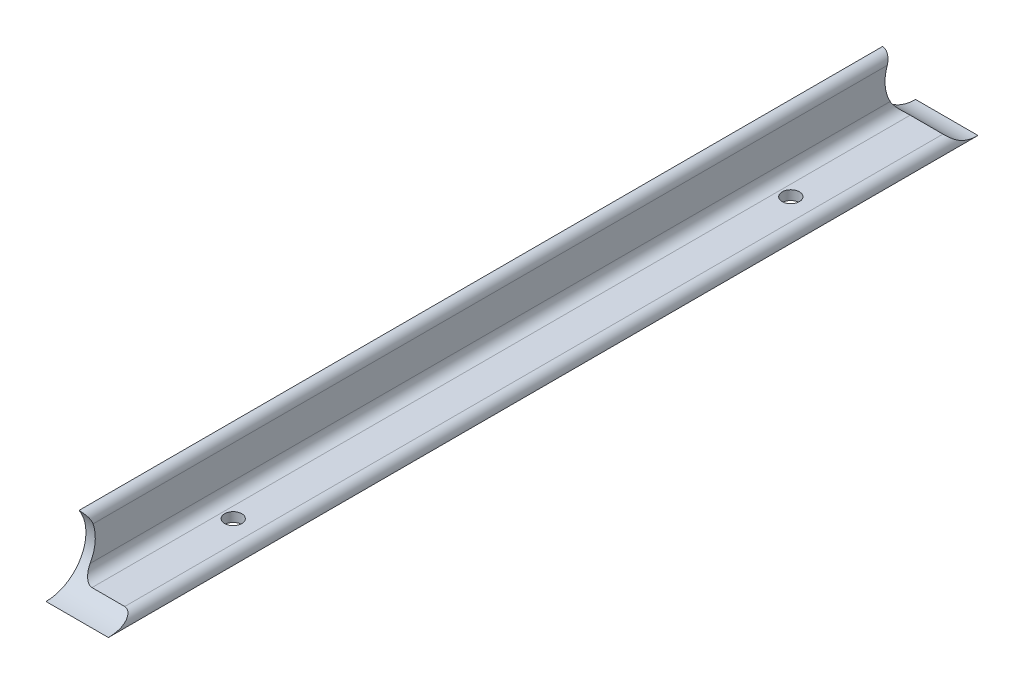
ISO-10303-21;
HEADER;
FILE_DESCRIPTION(('STEP AP214'),'2;1');
FILE_NAME('part.step','',(''),(''),'','','');
FILE_SCHEMA(('AUTOMOTIVE_DESIGN { 1 0 10303 214 1 1 1 1 }'));
ENDSEC;
DATA;
#1=APPLICATION_CONTEXT('core data for automotive mechanical design processes');
#2=APPLICATION_PROTOCOL_DEFINITION('international standard','automotive_design',2000,#1);
#3=PRODUCT_CONTEXT('',#1,'mechanical');
#4=PRODUCT('Part','Part','',(#3));
#5=PRODUCT_RELATED_PRODUCT_CATEGORY('part','',(#4));
#6=PRODUCT_DEFINITION_FORMATION('','',#4);
#7=PRODUCT_DEFINITION_CONTEXT('part definition',#1,'design');
#8=PRODUCT_DEFINITION('design','',#6,#7);
#9=PRODUCT_DEFINITION_SHAPE('','',#8);
#10=(LENGTH_UNIT() NAMED_UNIT(*) SI_UNIT(.MILLI.,.METRE.));
#11=(NAMED_UNIT(*) PLANE_ANGLE_UNIT() SI_UNIT($,.RADIAN.));
#12=(NAMED_UNIT(*) SI_UNIT($,.STERADIAN.) SOLID_ANGLE_UNIT());
#13=UNCERTAINTY_MEASURE_WITH_UNIT(LENGTH_MEASURE(1.E-05),#10,'distance_accuracy_value','');
#14=(GEOMETRIC_REPRESENTATION_CONTEXT(3) GLOBAL_UNCERTAINTY_ASSIGNED_CONTEXT((#13)) GLOBAL_UNIT_ASSIGNED_CONTEXT((#10,
#11,#12)) REPRESENTATION_CONTEXT('',''));
#15=CARTESIAN_POINT('',(0.,0.,0.));
#16=DIRECTION('',(0.,0.,1.));
#17=DIRECTION('',(1.,0.,0.));
#18=AXIS2_PLACEMENT_3D('',#15,#16,#17);
#19=CARTESIAN_POINT('',(17.,0.,181.370967741935));
#20=DIRECTION('',(0.,0.,-1.));
#21=DIRECTION('',(-1.,0.,0.));
#22=AXIS2_PLACEMENT_3D('',#19,#20,#21);
#23=CYLINDRICAL_SURFACE('',#22,3.);
#24=DIRECTION('',(0.,0.,-1.));
#25=VECTOR('',#24,1.);
#26=CARTESIAN_POINT('',(20.,0.,181.370967741935));
#27=LINE('',#26,#25);
#28=CARTESIAN_POINT('',(20.,0.,181.370967741935));
#29=VERTEX_POINT('',#28);
#30=CARTESIAN_POINT('',(20.,0.,-97.3290322580645));
#31=VERTEX_POINT('',#30);
#32=EDGE_CURVE('E13',#29,#31,#27,.T.);
#33=ORIENTED_EDGE('',*,*,#32,.T.);
#34=CARTESIAN_POINT('',(20.,0.,-97.3290322580645));
#35=CARTESIAN_POINT('',(19.9999705919109,-2.30458044158808E-06,-97.151286959261));
#36=CARTESIAN_POINT('',(19.9999989770571,0.00370226592440091,-96.9735418016605));
#37=CARTESIAN_POINT('',(19.9999599122283,0.0185087719111455,-96.6183558390309));
#38=CARTESIAN_POINT('',(19.9998924600866,0.0296108746273782,-96.4409150409735));
#39=CARTESIAN_POINT('',(19.9994499094464,0.0592209383889571,-96.0863520096989));
#40=CARTESIAN_POINT('',(19.9990742937025,0.0777413240784745,-95.9092308142354));
#41=CARTESIAN_POINT('',(19.9975949282692,0.122154254291076,-95.5559203973523));
#42=CARTESIAN_POINT('',(19.9964911898514,0.148046684689876,-95.3797311615484));
#43=CARTESIAN_POINT('',(19.9929752074295,0.207329591468886,-95.0275717615462));
#44=CARTESIAN_POINT('',(19.990555359875,0.240762970703646,-94.8516088849247));
#45=CARTESIAN_POINT('',(19.9836522455287,0.314973916303352,-94.5012803157926));
#46=CARTESIAN_POINT('',(19.9791690254037,0.355751316557974,-94.3269145872507));
#47=CARTESIAN_POINT('',(19.9672227090241,0.444514483171908,-93.9803087533219));
#48=CARTESIAN_POINT('',(19.9597625459986,0.492493125087825,-93.8080667271268));
#49=CARTESIAN_POINT('',(19.9407600650472,0.595547736239831,-93.4659704876463));
#50=CARTESIAN_POINT('',(19.9292185156824,0.650622367998201,-93.2961158310551));
#51=CARTESIAN_POINT('',(19.9024685493769,0.760575693164325,-92.9796859827366));
#52=CARTESIAN_POINT('',(19.887874684371,0.814667920668093,-92.832786020236));
#53=CARTESIAN_POINT('',(19.853481433853,0.927982337980099,-92.5415904722693));
#54=CARTESIAN_POINT('',(19.8336823059246,0.987204273846348,-92.3972947583088));
#55=CARTESIAN_POINT('',(19.7876954025515,1.11044027648882,-92.1119132540419));
#56=CARTESIAN_POINT('',(19.7615123704582,1.1744507609248,-91.9708251651159));
#57=CARTESIAN_POINT('',(19.7013693405175,1.30686409439148,-91.6924043279188));
#58=CARTESIAN_POINT('',(19.6674102916596,1.37526640670857,-91.555071123687));
#59=CARTESIAN_POINT('',(19.5957588590613,1.50556478484685,-91.3046943967056));
#60=CARTESIAN_POINT('',(19.5593322138692,1.56695585378169,-91.1910282741706));
#61=CARTESIAN_POINT('',(19.4785163705227,1.69189081979227,-90.9677215390118));
#62=CARTESIAN_POINT('',(19.4341258880658,1.75543506276086,-90.8580815791151));
#63=CARTESIAN_POINT('',(19.3362692288105,1.88370363459146,-90.6439740071685));
#64=CARTESIAN_POINT('',(19.2828231460854,1.94842507345105,-90.5394955907872));
#65=CARTESIAN_POINT('',(19.1655479709184,2.07798702817957,-90.3366857015394));
#66=CARTESIAN_POINT('',(19.1017259522081,2.14282743337522,-90.2383501036259));
#67=CARTESIAN_POINT('',(18.949823164493,2.28269447552456,-90.0321542582032));
#68=CARTESIAN_POINT('',(18.8594433824431,2.35745098877727,-89.9257711849516));
#69=CARTESIAN_POINT('',(18.6607215587142,2.50140061225797,-89.7268022318402));
#70=CARTESIAN_POINT('',(18.5523984627189,2.57059947737115,-89.6342019929326));
#71=CARTESIAN_POINT('',(18.3377433168696,2.68750138374114,-89.4814219945368));
#72=CARTESIAN_POINT('',(18.2343482603598,2.73684935436311,-89.4184046164781));
#73=CARTESIAN_POINT('',(18.0157301558414,2.82526779578833,-89.3072008653277));
#74=CARTESIAN_POINT('',(17.9005149294213,2.8643450027021,-89.2590047681106));
#75=CARTESIAN_POINT('',(17.6772358802356,2.9245227102832,-89.1855134983669));
#76=CARTESIAN_POINT('',(17.5703779091804,2.94735939747825,-89.1579763954258));
#77=CARTESIAN_POINT('',(17.3522544969219,2.9812787035469,-89.1172458479232));
#78=CARTESIAN_POINT('',(17.2409999263106,2.99238863543523,-89.1040190710948));
#79=CARTESIAN_POINT('',(17.1077454898133,2.99814309911651,-89.0971674443057));
#80=CARTESIAN_POINT('',(17.0862001547962,2.99883941073956,-89.0963383195839));
#81=CARTESIAN_POINT('',(17.0431054203398,2.99976710034989,-89.0952337560037));
#82=CARTESIAN_POINT('',(17.0215560434937,2.99999891199695,-89.0949578007032));
#83=CARTESIAN_POINT('',(17.,3.,-89.0949567179689));
#84=B_SPLINE_CURVE_WITH_KNOTS('',3,(#34,#35,#36,#37,#38,#39,#40,#41,#42,#43,#44,#45,#46,#47,#48,
#49,#50,#51,#52,#53,#54,#55,#56,#57,#58,#59,#60,#61,#62,#63,#64,#65,#66,#67,#68,#69,#70,#71,#72,
#73,#74,#75,#76,#77,#78,#79,#80,#81,#82,#83),.UNSPECIFIED.,.F.,.F.,(4,2,2,2,2,2,2,2,2,2,2,2,2,2,
2,2,2,2,2,2,2,2,2,2,4),(0.,0.533197095279369,1.06640624483335,1.60051220873631,2.13460990476388,
2.67182653411166,3.20903101398115,3.74570747957589,4.28228293803238,4.75377659608735,
5.22524692656226,5.69636800828246,6.16743162473257,6.56983043551344,6.97229419829307,
7.37387633093475,7.77518582667766,8.24881684700328,8.72195092873457,9.11270874235854,
9.5032096331857,9.83984379905429,10.1756921618371,10.2404043939398,10.3050561821395),.UNSPECIFIED.);
#85=CARTESIAN_POINT('',(17.,3.,-89.094956717969));
#86=VERTEX_POINT('',#85);
#87=EDGE_CURVE('E122',#31,#86,#84,.T.);
#88=ORIENTED_EDGE('',*,*,#87,.T.);
#89=DIRECTION('',(0.,0.,-1.));
#90=VECTOR('',#89,1.);
#91=CARTESIAN_POINT('',(17.,3.,181.370967741935));
#92=LINE('',#91,#90);
#93=CARTESIAN_POINT('',(17.,3.,173.13689220184));
#94=VERTEX_POINT('',#93);
#95=EDGE_CURVE('E71',#94,#86,#92,.T.);
#96=ORIENTED_EDGE('',*,*,#95,.F.);
#97=CARTESIAN_POINT('',(20.,0.,181.370967741935));
#98=CARTESIAN_POINT('',(19.9999705919109,-2.30458044134409E-06,181.193222443132));
#99=CARTESIAN_POINT('',(19.9999989770571,0.00370226592439925,181.015477285531));
#100=CARTESIAN_POINT('',(19.9999599122282,0.0185087719111425,180.660291322902));
#101=CARTESIAN_POINT('',(19.9998924600866,0.0296108746273763,180.482850524844));
#102=CARTESIAN_POINT('',(19.9994499094464,0.0592209383889577,180.12828749357));
#103=CARTESIAN_POINT('',(19.9990742937025,0.0777413240784772,179.951166298106));
#104=CARTESIAN_POINT('',(19.9975949282692,0.122154254291079,179.597855881223));
#105=CARTESIAN_POINT('',(19.9964911898514,0.148046684689875,179.421666645419));
#106=CARTESIAN_POINT('',(19.9929752074295,0.207329591468883,179.069507245417));
#107=CARTESIAN_POINT('',(19.990555359875,0.240762970703644,178.893544368796));
#108=CARTESIAN_POINT('',(19.9836522455287,0.314973916303348,178.543215799664));
#109=CARTESIAN_POINT('',(19.9791690254037,0.355751316557967,178.368850071122));
#110=CARTESIAN_POINT('',(19.967222709024,0.444514483171902,178.022244237193));
#111=CARTESIAN_POINT('',(19.9597625459986,0.492493125087822,177.850002210998));
#112=CARTESIAN_POINT('',(19.9407600650472,0.595547736239829,177.507905971517));
#113=CARTESIAN_POINT('',(19.9292185156824,0.650622367998197,177.338051314926));
#114=CARTESIAN_POINT('',(19.9024685493768,0.760575693164322,177.021621466608));
#115=CARTESIAN_POINT('',(19.887874684371,0.814667920668092,176.874721504107));
#116=CARTESIAN_POINT('',(19.853481433853,0.927982337980097,176.58352595614));
#117=CARTESIAN_POINT('',(19.8336823059246,0.987204273846343,176.43923024218));
#118=CARTESIAN_POINT('',(19.7876954025515,1.11044027648881,176.153848737913));
#119=CARTESIAN_POINT('',(19.7615123704582,1.17445076092479,176.012760648987));
#120=CARTESIAN_POINT('',(19.7013693405175,1.30686409439147,175.73433981179));
#121=CARTESIAN_POINT('',(19.6674102916596,1.37526640670856,175.597006607558));
#122=CARTESIAN_POINT('',(19.5957588590613,1.50556478484684,175.346629880577));
#123=CARTESIAN_POINT('',(19.5593322138692,1.56695585378168,175.232963758042));
#124=CARTESIAN_POINT('',(19.4785163705227,1.69189081979227,175.009657022883));
#125=CARTESIAN_POINT('',(19.4341258880658,1.75543506276085,174.900017062986));
#126=CARTESIAN_POINT('',(19.3362692288105,1.88370363459145,174.685909491039));
#127=CARTESIAN_POINT('',(19.2828231460854,1.94842507345105,174.581431074658));
#128=CARTESIAN_POINT('',(19.1655479709184,2.07798702817957,174.37862118541));
#129=CARTESIAN_POINT('',(19.101725952208,2.14282743337523,174.280285587497));
#130=CARTESIAN_POINT('',(18.949823164493,2.28269447552457,174.074089742074));
#131=CARTESIAN_POINT('',(18.859443382443,2.35745098877729,173.967706668823));
#132=CARTESIAN_POINT('',(18.6607215587142,2.50140061225798,173.768737715711));
#133=CARTESIAN_POINT('',(18.5523984627189,2.57059947737116,173.676137476804));
#134=CARTESIAN_POINT('',(18.3377433168696,2.68750138374115,173.523357478408));
#135=CARTESIAN_POINT('',(18.2343482603598,2.73684935436312,173.460340100349));
#136=CARTESIAN_POINT('',(18.0157301558414,2.82526779578833,173.349136349199));
#137=CARTESIAN_POINT('',(17.9005149294213,2.86434500270211,173.300940251982));
#138=CARTESIAN_POINT('',(17.6772358802356,2.9245227102832,173.227448982238));
#139=CARTESIAN_POINT('',(17.5703779091804,2.94735939747825,173.199911879297));
#140=CARTESIAN_POINT('',(17.3522544969218,2.98127870354691,173.159181331794));
#141=CARTESIAN_POINT('',(17.2409999263106,2.99238863543523,173.145954554966));
#142=CARTESIAN_POINT('',(17.1077454898132,2.99814309911651,173.139102928177));
#143=CARTESIAN_POINT('',(17.0862001547962,2.99883941073956,173.138273803455));
#144=CARTESIAN_POINT('',(17.0431054203398,2.99976710034989,173.137169239875));
#145=CARTESIAN_POINT('',(17.0215560434937,2.99999891199695,173.136893284574));
#146=CARTESIAN_POINT('',(17.,3.,173.13689220184));
#147=B_SPLINE_CURVE_WITH_KNOTS('',3,(#97,#98,#99,#100,#101,#102,#103,#104,#105,#106,#107,#108,
#109,#110,#111,#112,#113,#114,#115,#116,#117,#118,#119,#120,#121,#122,#123,#124,#125,#126,#127,
#128,#129,#130,#131,#132,#133,#134,#135,#136,#137,#138,#139,#140,#141,#142,#143,#144,#145,#146),
.UNSPECIFIED.,.F.,.F.,(4,2,2,2,2,2,2,2,2,2,2,2,2,2,2,2,2,2,2,2,2,2,2,2,4),(0.,0.533197095279341,
1.06640624483334,1.60051220873634,2.13460990476388,2.67182653411164,3.20903101398112,
3.74570747957588,4.28228293803239,4.75377659608734,5.22524692656226,5.69636800828244,
6.16743162473256,6.56983043551342,6.97229419829307,7.37387633093476,7.77518582667768,
8.2488168470033,8.72195092873459,9.11270874235857,9.50320963318574,9.83984379905433,
10.1756921618371,10.2404043939398,10.3050561821395),.UNSPECIFIED.);
#148=EDGE_CURVE('E127',#29,#94,#147,.T.);
#149=ORIENTED_EDGE('',*,*,#148,.F.);
#150=EDGE_LOOP('',(#33,#88,#96,#149));
#151=FACE_BOUND('',#150,.T.);
#152=ADVANCED_FACE('F62',(#151),#23,.T.);
#153=CARTESIAN_POINT('',(6.5,3.,181.370967741935));
#154=DIRECTION('',(0.,-1.,0.));
#155=DIRECTION('',(0.,0.,-1.));
#156=AXIS2_PLACEMENT_3D('',#153,#154,#155);
#157=PLANE('',#156);
#158=CARTESIAN_POINT('',(10.,3.,131.370967741935));
#159=DIRECTION('',(0.,-1.,0.));
#160=DIRECTION('',(0.,0.,-1.));
#161=AXIS2_PLACEMENT_3D('',#158,#159,#160);
#162=CIRCLE('',#161,2.75);
#163=CARTESIAN_POINT('',(10.,3.,128.620967741935));
#164=VERTEX_POINT('',#163);
#165=EDGE_CURVE('E252',#164,#164,#162,.T.);
#166=ORIENTED_EDGE('',*,*,#165,.T.);
#167=EDGE_LOOP('',(#166));
#168=FACE_BOUND('',#167,.T.);
#169=CARTESIAN_POINT('',(10.,3.,-47.3290322580645));
#170=DIRECTION('',(0.,-1.,0.));
#171=DIRECTION('',(0.,0.,-1.));
#172=AXIS2_PLACEMENT_3D('',#169,#170,#171);
#173=CIRCLE('',#172,2.75);
#174=CARTESIAN_POINT('',(10.,3.,-50.0790322580645));
#175=VERTEX_POINT('',#174);
#176=EDGE_CURVE('E137',#175,#175,#173,.T.);
#177=ORIENTED_EDGE('',*,*,#176,.T.);
#178=EDGE_LOOP('',(#177));
#179=FACE_BOUND('',#178,.T.);
#180=ORIENTED_EDGE('',*,*,#95,.T.);
#181=DIRECTION('',(-1.,0.,0.));
#182=VECTOR('',#181,1.);
#183=CARTESIAN_POINT('',(20.,3.,-89.094956717969));
#184=LINE('',#183,#182);
#185=CARTESIAN_POINT('',(6.50000000000002,3.,-89.094956717969));
#186=VERTEX_POINT('',#185);
#187=EDGE_CURVE('E158',#86,#186,#184,.T.);
#188=ORIENTED_EDGE('',*,*,#187,.T.);
#189=DIRECTION('',(0.,0.,-1.));
#190=VECTOR('',#189,1.);
#191=CARTESIAN_POINT('',(6.5,3.,181.370967741935));
#192=LINE('',#191,#190);
#193=CARTESIAN_POINT('',(6.5,3.,173.13689220184));
#194=VERTEX_POINT('',#193);
#195=EDGE_CURVE('E149',#194,#186,#192,.T.);
#196=ORIENTED_EDGE('',*,*,#195,.F.);
#197=DIRECTION('',(-1.,0.,0.));
#198=VECTOR('',#197,1.);
#199=CARTESIAN_POINT('',(20.,3.,173.13689220184));
#200=LINE('',#199,#198);
#201=EDGE_CURVE('E159',#94,#194,#200,.T.);
#202=ORIENTED_EDGE('',*,*,#201,.F.);
#203=EDGE_LOOP('',(#180,#188,#196,#202));
#204=FACE_BOUND('',#203,.T.);
#205=ADVANCED_FACE('F156',(#168,#179,#204),#157,.F.);
#206=CARTESIAN_POINT('',(6.5,6.5,181.370967741935));
#207=DIRECTION('',(0.,0.,-1.));
#208=DIRECTION('',(-1.,0.,0.));
#209=AXIS2_PLACEMENT_3D('',#206,#207,#208);
#210=CYLINDRICAL_SURFACE('',#209,3.5);
#211=ORIENTED_EDGE('',*,*,#195,.T.);
#212=CARTESIAN_POINT('',(3.00000000000001,6.5,-86.1867703692019));
#213=CARTESIAN_POINT('',(3.00001438430895,6.69249076170441,-86.0779461939233));
#214=CARTESIAN_POINT('',(3.01594051187548,6.88807416675023,-85.9740044289324));
#215=CARTESIAN_POINT('',(3.06557485987402,7.18164263873906,-85.8274591133879));
#216=CARTESIAN_POINT('',(3.08644237048736,7.27962352718961,-85.7801316934944));
#217=CARTESIAN_POINT('',(3.13699442735603,7.47485394063439,-85.688826737077));
#218=CARTESIAN_POINT('',(3.16667474862637,7.5721037932427,-85.6448476080005));
#219=CARTESIAN_POINT('',(3.23517396005618,7.76550179323352,-85.5602157920757));
#220=CARTESIAN_POINT('',(3.27404079092235,7.8616412875016,-85.5195821169696));
#221=CARTESIAN_POINT('',(3.36082247531485,8.05126694401863,-85.4420638285306));
#222=CARTESIAN_POINT('',(3.40873338762511,8.14475424170108,-85.4051775928742));
#223=CARTESIAN_POINT('',(3.51347524400578,8.32806191859332,-85.3352257676298));
#224=CARTESIAN_POINT('',(3.57030391973867,8.41788322299028,-85.3021592101651));
#225=CARTESIAN_POINT('',(3.69261254411521,8.59283647549661,-85.2398470894413));
#226=CARTESIAN_POINT('',(3.75809167982938,8.6779688631844,-85.2106011676498));
#227=CARTESIAN_POINT('',(3.89107527644851,8.83519824084304,-85.1583054318629));
#228=CARTESIAN_POINT('',(3.95788083468138,8.9077810493489,-85.134935822053));
#229=CARTESIAN_POINT('',(4.09791701900058,9.04750553548502,-85.0912160222846));
#230=CARTESIAN_POINT('',(4.171149800268,9.11464537334482,-85.0708668513451));
#231=CARTESIAN_POINT('',(4.32347513381164,9.24274163191564,-85.0330827956665));
#232=CARTESIAN_POINT('',(4.40256449411882,9.30370137861542,-85.0156463400602));
#233=CARTESIAN_POINT('',(4.56604695661098,9.41887726904527,-84.9835237251387));
#234=CARTESIAN_POINT('',(4.65044197425143,9.47309095601435,-84.9688385668045));
#235=CARTESIAN_POINT('',(4.90243753770417,9.61998061719608,-84.9299414878503));
#236=CARTESIAN_POINT('',(5.07628267359169,9.70311855970735,-84.9091193629517));
#237=CARTESIAN_POINT('',(5.43585501807313,9.83985791327713,-84.8758177656406));
#238=CARTESIAN_POINT('',(5.62158134388367,9.89346151592604,-84.8633376741944));
#239=CARTESIAN_POINT('',(5.99843462564227,9.96916523570845,-84.8459283111652));
#240=CARTESIAN_POINT('',(6.18951808074272,9.99147002421159,-84.8409499676553));
#241=CARTESIAN_POINT('',(6.5728083756654,10.0044939041429,-84.8380277006437));
#242=CARTESIAN_POINT('',(6.7650152264914,9.99521268566409,-84.8400838461611));
#243=CARTESIAN_POINT('',(7.14535882529886,9.94533622161214,-84.8513907285801));
#244=CARTESIAN_POINT('',(7.33349007523151,9.9047010917387,-84.8606506292702));
#245=CARTESIAN_POINT('',(7.70006790428329,9.7934062487136,-84.8870212145566));
#246=CARTESIAN_POINT('',(7.87851479571284,9.72274750444165,-84.9041316458131));
#247=CARTESIAN_POINT('',(8.2204915380453,9.55388852013163,-84.9471783845597));
#248=CARTESIAN_POINT('',(8.38403553236299,9.45571476133489,-84.9731062110299));
#249=CARTESIAN_POINT('',(8.69183848399812,9.2352650315718,-85.0348986729943));
#250=CARTESIAN_POINT('',(8.83609891456236,9.11299090362002,-85.0707625487393));
#251=CARTESIAN_POINT('',(9.1018507615375,8.84852631443399,-85.1534406133708));
#252=CARTESIAN_POINT('',(9.22330175548544,8.70630126113879,-85.2002739182069));
#253=CARTESIAN_POINT('',(9.44050472804683,8.40724904516879,-85.3053544547688));
#254=CARTESIAN_POINT('',(9.53625562511618,8.2504212683376,-85.363602166672));
#255=CARTESIAN_POINT('',(9.70295467622914,7.92326400538632,-85.4931050379818));
#256=CARTESIAN_POINT('',(9.77317726652261,7.75268667410304,-85.5646643388124));
#257=CARTESIAN_POINT('',(9.88522354087848,7.40733617812521,-85.7189081575622));
#258=CARTESIAN_POINT('',(9.92703814031438,7.23256168969864,-85.8015962242446));
#259=CARTESIAN_POINT('',(9.98567836144707,6.86950658925919,-85.9838250524668));
#260=CARTESIAN_POINT('',(10.0002168725691,6.6812734089285,-86.0841871202105));
#261=CARTESIAN_POINT('',(9.99977790675991,6.31017455993754,-86.2941912279664));
#262=CARTESIAN_POINT('',(9.9847897140814,6.12731086439931,-86.4038366232367));
#263=CARTESIAN_POINT('',(9.92390651984183,5.7455015216885,-86.6457763935544));
#264=CARTESIAN_POINT('',(9.87400449979794,5.5478543192168,-86.779100354346));
#265=CARTESIAN_POINT('',(9.74253140909786,5.16709585724981,-87.0512112380107));
#266=CARTESIAN_POINT('',(9.66092238572637,4.98400233582887,-87.1900045279914));
#267=CARTESIAN_POINT('',(9.50931387202572,4.70913768635394,-87.4096290687725));
#268=CARTESIAN_POINT('',(9.44905661405106,4.61155428138047,-87.4900914381613));
#269=CARTESIAN_POINT('',(9.31904490110326,4.42246476661921,-87.6505891577817));
#270=CARTESIAN_POINT('',(9.24928825873391,4.33096006379837,-87.7306244052371));
#271=CARTESIAN_POINT('',(9.10043568142349,4.15456834325593,-87.8891927625398));
#272=CARTESIAN_POINT('',(9.02134402634646,4.06967832228167,-87.9677265417291));
#273=CARTESIAN_POINT('',(8.85378497912895,3.90706405070727,-88.1220642094841));
#274=CARTESIAN_POINT('',(8.76532156891263,3.82933678279652,-88.1978692392593));
#275=CARTESIAN_POINT('',(8.54419449095083,3.65432063613168,-88.372641848613));
#276=CARTESIAN_POINT('',(8.40730044584547,3.56045813839488,-88.469781631361));
#277=CARTESIAN_POINT('',(8.11504952844723,3.39032282270294,-88.6507052493411));
#278=CARTESIAN_POINT('',(7.95972806523425,3.31401707253233,-88.7345139976597));
#279=CARTESIAN_POINT('',(7.6705296711605,3.19879941812471,-88.8636572913999));
#280=CARTESIAN_POINT('',(7.54047079658603,3.15530794803642,-88.9133976503763));
#281=CARTESIAN_POINT('',(7.27122561951199,3.08320136219005,-88.996751229433));
#282=CARTESIAN_POINT('',(7.13204991566185,3.05456930571819,-89.0303828111962));
#283=CARTESIAN_POINT('',(6.91843994192546,3.02434422292118,-89.0660556980258));
#284=CARTESIAN_POINT('',(6.84605648840916,3.0163823801741,-89.0754936980399));
#285=CARTESIAN_POINT('',(6.70045084851071,3.00498381778933,-89.0890236419988));
#286=CARTESIAN_POINT('',(6.62722907688284,3.00154495039176,-89.0931181233359));
#287=CARTESIAN_POINT('',(6.48061500898491,2.99928583797149,-89.0958065787766));
#288=CARTESIAN_POINT('',(6.40722271817424,3.00046544706456,-89.0944007266197));
#289=CARTESIAN_POINT('',(6.26098414073314,3.00740230943953,-89.0861532323992));
#290=CARTESIAN_POINT('',(6.18813782359144,3.01315930496348,-89.0793118964141));
#291=CARTESIAN_POINT('',(5.98960278885129,3.03509294922052,-89.0533397687532));
#292=CARTESIAN_POINT('',(5.86506792531205,3.05583991509931,-89.0288470865692));
#293=CARTESIAN_POINT('',(5.62234318725361,3.10953683728016,-88.9662219247379));
#294=CARTESIAN_POINT('',(5.50415706369828,3.14249391871368,-88.9280814814756));
#295=CARTESIAN_POINT('',(5.22110302596565,3.23717131503061,-88.8202386242306));
#296=CARTESIAN_POINT('',(5.06075634536665,3.30511707984,-88.744151807097));
#297=CARTESIAN_POINT('',(4.7580167794152,3.45951634794141,-88.5764109828072));
#298=CARTESIAN_POINT('',(4.61567268620371,3.54601850504609,-88.4847161855126));
#299=CARTESIAN_POINT('',(4.38838668304211,3.70638883413859,-88.3204101455268));
#300=CARTESIAN_POINT('',(4.298926264846,3.77641637483911,-88.2501853046113));
#301=CARTESIAN_POINT('',(4.12863270130013,3.92332108440583,-88.1064967227678));
#302=CARTESIAN_POINT('',(4.04780298897324,4.00020095676952,-88.0330317092985));
#303=CARTESIAN_POINT('',(3.81793326235757,4.24042367341211,-87.809512694328));
#304=CARTESIAN_POINT('',(3.68154650000396,4.41332524401064,-87.6563601931507));
#305=CARTESIAN_POINT('',(3.50179533463084,4.69078523103983,-87.4247026641425));
#306=CARTESIAN_POINT('',(3.44554395098377,4.787448986911,-87.3462946809105));
#307=CARTESIAN_POINT('',(3.34235665302385,4.98612557704905,-87.1900338783868));
#308=CARTESIAN_POINT('',(3.2954208627752,5.08813848253254,-87.112181066502));
#309=CARTESIAN_POINT('',(3.2114013195618,5.29678180320945,-86.9579901788444));
#310=CARTESIAN_POINT('',(3.17429234995162,5.40339956685716,-86.8816487004472));
#311=CARTESIAN_POINT('',(3.11027723147972,5.62100070287194,-86.7309437966434));
#312=CARTESIAN_POINT('',(3.08336969625694,5.7319834797754,-86.6565801037367));
#313=CARTESIAN_POINT('',(3.041614660786,5.95112389102162,-86.5147405178157));
#314=CARTESIAN_POINT('',(3.02615406317884,6.05906736184054,-86.4471161125642));
#315=CARTESIAN_POINT('',(3.00534045521206,6.2776594078762,-86.3147025320994));
#316=CARTESIAN_POINT('',(2.99999165364334,6.3883090900873,-86.2499145484329));
#317=CARTESIAN_POINT('',(3.00000000000001,6.5,-86.1867703692019));
#318=B_SPLINE_CURVE_WITH_KNOTS('',3,(#212,#213,#214,#215,#216,#217,#218,#219,#220,#221,#222,
#223,#224,#225,#226,#227,#228,#229,#230,#231,#232,#233,#234,#235,#236,#237,#238,#239,#240,#241,
#242,#243,#244,#245,#246,#247,#248,#249,#250,#251,#252,#253,#254,#255,#256,#257,#258,#259,#260,
#261,#262,#263,#264,#265,#266,#267,#268,#269,#270,#271,#272,#273,#274,#275,#276,#277,#278,#279,
#280,#281,#282,#283,#284,#285,#286,#287,#288,#289,#290,#291,#292,#293,#294,#295,#296,#297,#298,
#299,#300,#301,#302,#303,#304,#305,#306,#307,#308,#309,#310,#311,#312,#313,#314,#315,#316,#317),
.UNSPECIFIED.,.T.,.F.,(4,2,2,2,2,2,2,2,2,2,2,2,2,2,2,2,2,2,2,2,2,2,2,2,2,2,2,2,2,2,2,2,2,2,2,2,
2,2,2,2,2,2,2,2,2,2,2,2,2,2,2,2,4),(0.,0.6628827304224,0.994951079985766,1.32686048766404,
1.66054180626076,1.99407804800971,2.32752958801965,2.66094981408568,2.96469592040253,
3.26854427109957,3.57222821942123,3.87602244083047,4.4544652404212,5.03286511098481,
5.60746475798359,6.18207004269994,6.75740747176495,7.33272633576207,7.90749338658209,
8.48221650059199,9.0579487109019,9.63370514610783,10.2247393584939,10.8159624895855,
11.454863475465,12.0939963721861,12.8219821008044,13.5508419133266,13.9707495802678,
14.3907541021653,14.8105668053331,15.2302018461189,15.8053592809236,16.3794289003909,
16.8155249824884,17.2511227879622,17.4711217511511,17.6910162088531,17.910903720786,
18.1307788514749,18.5148151564762,18.8990759171874,19.4660322769216,20.0344937407803,
20.4346711919256,20.8350072326839,21.635824246103,22.0452797787853,22.4547407641925,
22.8631406184349,23.2714849517812,23.6559562778156,24.0405875955512),.UNSPECIFIED.);
#319=CARTESIAN_POINT('',(3.00000000000001,6.5,-86.1867703692019));
#320=VERTEX_POINT('',#319);
#321=EDGE_CURVE('E165',#186,#320,#318,.T.);
#322=ORIENTED_EDGE('',*,*,#321,.T.);
#323=DIRECTION('',(0.,0.,-1.));
#324=VECTOR('',#323,1.);
#325=CARTESIAN_POINT('',(3.,6.5,181.370967741935));
#326=LINE('',#325,#324);
#327=CARTESIAN_POINT('',(3.,6.5,170.228705853073));
#328=VERTEX_POINT('',#327);
#329=EDGE_CURVE('E146',#328,#320,#326,.T.);
#330=ORIENTED_EDGE('',*,*,#329,.F.);
#331=CARTESIAN_POINT('',(6.5,3.,173.13689220184));
#332=CARTESIAN_POINT('',(6.42259108530008,2.99997615779608,173.136932021426));
#333=CARTESIAN_POINT('',(6.34521049613182,3.00256706100367,173.133837102259));
#334=CARTESIAN_POINT('',(6.19136579467073,3.01278988354558,173.121687121326));
#335=CARTESIAN_POINT('',(6.11490049437666,3.02041432834783,173.112640896992));
#336=CARTESIAN_POINT('',(5.96446156854595,3.04039073339572,173.089044842414));
#337=CARTESIAN_POINT('',(5.89046872198488,3.05268221409427,173.074565447065));
#338=CARTESIAN_POINT('',(5.74453320695992,3.08169470633635,173.040598908345));
#339=CARTESIAN_POINT('',(5.67259118600823,3.0984171000762,173.021110202407));
#340=CARTESIAN_POINT('',(5.46134232275791,3.15451109226658,172.956231600432));
#341=CARTESIAN_POINT('',(5.32560308966281,3.19995076456175,172.904257977799));
#342=CARTESIAN_POINT('',(5.06521771658112,3.30449808161049,172.787166477012));
#343=CARTESIAN_POINT('',(4.94061599472347,3.36365734275349,172.721999081333));
#344=CARTESIAN_POINT('',(4.63495085625347,3.53066685700255,172.542507785088));
#345=CARTESIAN_POINT('',(4.46243245339309,3.64699617808637,172.421409770992));
#346=CARTESIAN_POINT('',(4.22487160874183,3.83839199521029,172.231064195176));
#347=CARTESIAN_POINT('',(4.14913969907257,3.90510128800764,172.166079482328));
#348=CARTESIAN_POINT('',(4.00459301331332,4.04379057810757,172.034055073548));
#349=CARTESIAN_POINT('',(3.93577730321153,4.11576986143842,171.967015656696));
#350=CARTESIAN_POINT('',(3.73532294750269,4.34396280941257,171.759593869105));
#351=CARTESIAN_POINT('',(3.61483446400873,4.50824201431266,171.617142426288));
#352=CARTESIAN_POINT('',(3.40405625194774,4.85495554091958,171.332717711562));
#353=CARTESIAN_POINT('',(3.31371585356481,5.03735872506837,171.190744038397));
#354=CARTESIAN_POINT('',(3.20100978506624,5.3261815759383,170.978804607802));
#355=CARTESIAN_POINT('',(3.16686594513598,5.42686221514029,170.907106123448));
#356=CARTESIAN_POINT('',(3.10764061744334,5.63207157635464,170.765482110786));
#357=CARTESIAN_POINT('',(3.0825576099369,5.73659964980553,170.695556286986));
#358=CARTESIAN_POINT('',(3.04188178935846,5.94937350227185,170.557780897233));
#359=CARTESIAN_POINT('',(3.02632271989438,6.05763108089713,170.48993951338));
#360=CARTESIAN_POINT('',(3.00537924035695,6.27691986485622,170.357068211929));
#361=CARTESIAN_POINT('',(3.0000020145823,6.38795297267195,170.292040311112));
#362=CARTESIAN_POINT('',(3.,6.50000000000001,170.228705853073));
#363=B_SPLINE_CURVE_WITH_KNOTS('',3,(#331,#332,#333,#334,#335,#336,#337,#338,#339,#340,#341,
#342,#343,#344,#345,#346,#347,#348,#349,#350,#351,#352,#353,#354,#355,#356,#357,#358,#359,#360,
#361,#362),.UNSPECIFIED.,.F.,.F.,(4,2,2,2,2,2,2,2,2,2,2,2,2,2,2,4),(0.,0.232076005603786,
0.46380816394217,0.692634516568072,0.921532334387818,1.37626948241987,1.83274604120005,
2.55071600647745,2.91059905792616,3.27043344276819,4.01350901705591,4.75532934117932,
5.13969299148203,5.52399214374857,5.9096451157163,6.29557010277982),.UNSPECIFIED.);
#364=EDGE_CURVE('E208',#194,#328,#363,.T.);
#365=ORIENTED_EDGE('',*,*,#364,.F.);
#366=EDGE_LOOP('',(#211,#322,#330,#365));
#367=FACE_BOUND('',#366,.T.);
#368=ADVANCED_FACE('F200',(#367),#210,.F.);
#369=CARTESIAN_POINT('',(3.,17.,181.370967741935));
#370=DIRECTION('',(-1.,0.,0.));
#371=DIRECTION('',(0.,-1.,0.));
#372=AXIS2_PLACEMENT_3D('',#369,#370,#371);
#373=PLANE('',#372);
#374=ORIENTED_EDGE('',*,*,#329,.T.);
#375=CARTESIAN_POINT('',(3.00000000000001,12.8,-97.3290322580645));
#376=DIRECTION('',(-1.,0.,0.));
#377=DIRECTION('',(0.,-1.,0.));
#378=AXIS2_PLACEMENT_3D('',#375,#376,#377);
#379=CIRCLE('',#378,12.8);
#380=CARTESIAN_POINT('',(3.00000000000266,17.0000000000007,-85.2377130579105));
#381=VERTEX_POINT('',#380);
#382=EDGE_CURVE('E199',#320,#381,#379,.T.);
#383=ORIENTED_EDGE('',*,*,#382,.T.);
#384=DIRECTION('',(0.,0.,-1.));
#385=VECTOR('',#384,1.);
#386=CARTESIAN_POINT('',(3.,17.,181.370967741935));
#387=LINE('',#386,#385);
#388=CARTESIAN_POINT('',(3.,17.,169.279648541782));
#389=VERTEX_POINT('',#388);
#390=EDGE_CURVE('E140',#389,#381,#387,.T.);
#391=ORIENTED_EDGE('',*,*,#390,.F.);
#392=CARTESIAN_POINT('',(3.,12.8,181.370967741935));
#393=DIRECTION('',(-1.,0.,0.));
#394=DIRECTION('',(0.,-1.,0.));
#395=AXIS2_PLACEMENT_3D('',#392,#393,#394);
#396=CIRCLE('',#395,12.8);
#397=EDGE_CURVE('E215',#328,#389,#396,.F.);
#398=ORIENTED_EDGE('',*,*,#397,.F.);
#399=EDGE_LOOP('',(#374,#383,#391,#398));
#400=FACE_BOUND('',#399,.T.);
#401=ADVANCED_FACE('F204',(#400),#373,.F.);
#402=CARTESIAN_POINT('',(0.,17.,181.370967741935));
#403=DIRECTION('',(0.,0.,-1.));
#404=DIRECTION('',(-1.,0.,0.));
#405=AXIS2_PLACEMENT_3D('',#402,#403,#404);
#406=CYLINDRICAL_SURFACE('',#405,3.);
#407=ORIENTED_EDGE('',*,*,#390,.T.);
#408=CARTESIAN_POINT('',(0.,14.,-84.5854064004053));
#409=CARTESIAN_POINT('',(0.0838587004778018,13.9999917954332,-84.5854117757487));
#410=CARTESIAN_POINT('',(0.16771377918815,14.0035161138986,-84.5857376555255));
#411=CARTESIAN_POINT('',(0.334827035391326,14.0175665317182,-84.5870691841577));
#412=CARTESIAN_POINT('',(0.418085233532624,14.0280923876685,-84.5880748093821));
#413=CARTESIAN_POINT('',(0.583378717152902,14.0560754681949,-84.5908038862764));
#414=CARTESIAN_POINT('',(0.665414606107358,14.0735291462166,-84.5925269706801));
#415=CARTESIAN_POINT('',(0.827697792848426,14.1152218173217,-84.5967651280148));
#416=CARTESIAN_POINT('',(0.90794511727032,14.139460709287,-84.5992801891433));
#417=CARTESIAN_POINT('',(1.14524090025106,14.2221549752386,-84.6081595988997));
#418=CARTESIAN_POINT('',(1.29889746540348,14.2905971869695,-84.6158589393922));
#419=CARTESIAN_POINT('',(1.59230189106436,14.4519351468451,-84.6358187702943));
#420=CARTESIAN_POINT('',(1.73205376445527,14.5448238113896,-84.648077939873));
#421=CARTESIAN_POINT('',(1.99338217406264,14.7518659188611,-84.6782972255043));
#422=CARTESIAN_POINT('',(2.11501653217971,14.8659489810803,-84.6962386075915));
#423=CARTESIAN_POINT('',(2.33724866225118,15.1119452719574,-84.7389386448706));
#424=CARTESIAN_POINT('',(2.43784481883331,15.2438598684913,-84.7636978232142));
#425=CARTESIAN_POINT('',(2.61508491467652,15.5207264848941,-84.8207341621955));
#426=CARTESIAN_POINT('',(2.69181439696923,15.6656294876798,-84.8529837321543));
#427=CARTESIAN_POINT('',(2.82022415840432,15.9642584970067,-84.9253611129461));
#428=CARTESIAN_POINT('',(2.87190496542596,16.1179843175382,-84.9654887577306));
#429=CARTESIAN_POINT('',(2.95032994151914,16.4323300231513,-85.0541273927335));
#430=CARTESIAN_POINT('',(2.97662854912236,16.5930230893662,-85.1027710620394));
#431=CARTESIAN_POINT('',(3.00310620497495,16.9142576335099,-85.2070920506004));
#432=CARTESIAN_POINT('',(3.00327815795188,17.0747990584204,-85.2627712764082));
#433=CARTESIAN_POINT('',(2.97785695923652,17.4007033450325,-85.3830974722661));
#434=CARTESIAN_POINT('',(2.95081711421092,17.5658310582712,-85.4480723755081));
#435=CARTESIAN_POINT('',(2.87045281728447,17.8877219698135,-85.5823072613097));
#436=CARTESIAN_POINT('',(2.81711963351266,18.0444823701994,-85.6515686607043));
#437=CARTESIAN_POINT('',(2.68081720527856,18.3581939266408,-85.7973953133892));
#438=CARTESIAN_POINT('',(2.59587220573101,18.5142191216507,-85.8741107275561));
#439=CARTESIAN_POINT('',(2.39941964750775,18.8094925592625,-86.0262169830504));
#440=CARTESIAN_POINT('',(2.28789032570523,18.948726914747,-86.1016066845067));
#441=CARTESIAN_POINT('',(2.03619311211298,19.2108807253315,-86.2491433893853));
#442=CARTESIAN_POINT('',(1.8952262706786,19.3331393679826,-86.3211106549019));
#443=CARTESIAN_POINT('',(1.58943478346172,19.5512375349608,-86.4535050875951));
#444=CARTESIAN_POINT('',(1.42464654576409,19.6471167392396,-86.5139495448473));
#445=CARTESIAN_POINT('',(1.11926820822537,19.7871079643578,-86.6040411904353));
#446=CARTESIAN_POINT('',(0.982999470246764,19.8381738814674,-86.6376105318273));
#447=CARTESIAN_POINT('',(0.702284892551834,19.9202822590272,-86.6921132254116));
#448=CARTESIAN_POINT('',(0.557858868212211,19.9513711484041,-86.7130758697003));
#449=CARTESIAN_POINT('',(0.343442004848442,19.981070947029,-86.7331683993429));
#450=CARTESIAN_POINT('',(0.275038815241134,19.9881584254478,-86.7379782239177));
#451=CARTESIAN_POINT('',(0.137769542072402,19.9976238343111,-86.7444099445907));
#452=CARTESIAN_POINT('',(0.0689035305302231,20.0000024812118,-86.7460323256632));
#453=CARTESIAN_POINT('',(0.,20.,-86.7460270138062));
#454=B_SPLINE_CURVE_WITH_KNOTS('',3,(#408,#409,#410,#411,#412,#413,#414,#415,#416,#417,#418,
#419,#420,#421,#422,#423,#424,#425,#426,#427,#428,#429,#430,#431,#432,#433,#434,#435,#436,#437,
#438,#439,#440,#441,#442,#443,#444,#445,#446,#447,#448,#449,#450,#451,#452,#453),.UNSPECIFIED.,
.F.,.F.,(4,2,2,2,2,2,2,2,2,2,2,2,2,2,2,2,2,2,2,2,2,2,4),(0.,0.251494857952215,0.502980973303851,
0.754338511269005,1.00569230351634,1.50823671854144,2.01063567639737,2.51139519769291,
3.01219315460745,3.51117489643487,4.01014612219465,4.51772509074482,5.02544190337349,
5.56165599936136,6.0980482891315,6.67599323186646,7.25441294129387,7.85125394977617,
8.44719221971429,8.89341494074193,9.3385968012387,9.54520610619132,9.75178397279515),.UNSPECIFIED.);
#455=CARTESIAN_POINT('',(0.,20.,-86.7460270138062));
#456=VERTEX_POINT('',#455);
#457=EDGE_CURVE('E136',#381,#456,#454,.T.);
#458=ORIENTED_EDGE('',*,*,#457,.T.);
#459=DIRECTION('',(0.,0.,-1.));
#460=VECTOR('',#459,1.);
#461=CARTESIAN_POINT('',(0.,20.,181.370967741935));
#462=LINE('',#461,#460);
#463=CARTESIAN_POINT('',(0.,20.,170.787962497677));
#464=VERTEX_POINT('',#463);
#465=EDGE_CURVE('E135',#464,#456,#462,.T.);
#466=ORIENTED_EDGE('',*,*,#465,.F.);
#467=CARTESIAN_POINT('',(3.,17.,169.279648541782));
#468=CARTESIAN_POINT('',(3.00000554972214,17.0911618760815,169.311303259774));
#469=CARTESIAN_POINT('',(2.99584525826283,17.1819382550868,169.344001001753));
#470=CARTESIAN_POINT('',(2.979443330081,17.3620528272277,169.41116680529));
#471=CARTESIAN_POINT('',(2.96720522370495,17.4513916311796,169.445634087419));
#472=CARTESIAN_POINT('',(2.9349359236426,17.6278349049108,169.515967835706));
#473=CARTESIAN_POINT('',(2.91492329938314,17.7149441754199,169.551830786015));
#474=CARTESIAN_POINT('',(2.86738560165416,17.8865875210446,169.62467740005));
#475=CARTESIAN_POINT('',(2.83985974364951,17.9711213262038,169.661661180454));
#476=CARTESIAN_POINT('',(2.74649998237213,18.2198493453928,169.773635112871));
#477=CARTESIAN_POINT('',(2.66980698786149,18.3795821496473,169.849813500602));
#478=CARTESIAN_POINT('',(2.48949326339304,18.6833610549116,170.001929031893));
#479=CARTESIAN_POINT('',(2.38583910059819,18.827387362334,170.077865756596));
#480=CARTESIAN_POINT('',(2.14914799160541,19.1012173859025,170.228260514692));
#481=CARTESIAN_POINT('',(2.01516432990391,19.2302960255928,170.30255940296));
#482=CARTESIAN_POINT('',(1.72249345702341,19.4633075516709,170.44125012902));
#483=CARTESIAN_POINT('',(1.56384044784965,19.5672747509515,170.505655441303));
#484=CARTESIAN_POINT('',(1.26537178416366,19.7239992135077,170.605061630999));
#485=CARTESIAN_POINT('',(1.12996262010247,19.7830520571935,170.643414552005));
#486=CARTESIAN_POINT('',(0.849440286600171,19.8810422714503,170.707839535837));
#487=CARTESIAN_POINT('',(0.704349650488756,19.9200246294575,170.733939052643));
#488=CARTESIAN_POINT('',(0.465196868978756,19.9651672078108,170.764327765565));
#489=CARTESIAN_POINT('',(0.372943900849582,19.9781834051646,170.773143875332));
#490=CARTESIAN_POINT('',(0.187150765531372,19.9956172322102,170.784980453583));
#491=CARTESIAN_POINT('',(0.0936091590781357,20.0000243019467,170.78799380434));
#492=CARTESIAN_POINT('',(0.,20.,170.787962497677));
#493=B_SPLINE_CURVE_WITH_KNOTS('',3,(#467,#468,#469,#470,#471,#472,#473,#474,#475,#476,#477,
#478,#479,#480,#481,#482,#483,#484,#485,#486,#487,#488,#489,#490,#491,#492),.UNSPECIFIED.,.F.,
.F.,(4,2,2,2,2,2,2,2,2,2,2,2,4),(0.,0.289374765870081,0.57862314640369,0.867184863619346,
1.15577672410993,1.73162477500245,2.30819033139856,2.90612746460204,3.50324287993925,
3.95927119915783,4.41427284408597,4.69448132076577,4.97503328586395),.UNSPECIFIED.);
#494=EDGE_CURVE('E163',#389,#464,#493,.T.);
#495=ORIENTED_EDGE('',*,*,#494,.F.);
#496=EDGE_LOOP('',(#407,#458,#466,#495));
#497=FACE_BOUND('',#496,.T.);
#498=ADVANCED_FACE('F232',(#497),#406,.T.);
#499=CARTESIAN_POINT('',(0.,0.,181.370967741935));
#500=DIRECTION('',(1.,0.,0.));
#501=DIRECTION('',(0.,0.,-1.));
#502=AXIS2_PLACEMENT_3D('',#499,#500,#501);
#503=PLANE('',#502);
#504=ORIENTED_EDGE('',*,*,#465,.T.);
#505=CARTESIAN_POINT('',(0.,12.8,-97.3290322580645));
#506=DIRECTION('',(-1.,0.,0.));
#507=DIRECTION('',(0.,0.,1.));
#508=AXIS2_PLACEMENT_3D('',#505,#506,#507);
#509=CIRCLE('',#508,12.8);
#510=CARTESIAN_POINT('',(0.,0.,-97.3290322580645));
#511=VERTEX_POINT('',#510);
#512=EDGE_CURVE('E119',#511,#456,#509,.T.);
#513=ORIENTED_EDGE('',*,*,#512,.F.);
#514=DIRECTION('',(0.,0.,-1.));
#515=VECTOR('',#514,1.);
#516=CARTESIAN_POINT('',(0.,0.,181.370967741935));
#517=LINE('',#516,#515);
#518=CARTESIAN_POINT('',(0.,0.,181.370967741935));
#519=VERTEX_POINT('',#518);
#520=EDGE_CURVE('E132',#519,#511,#517,.T.);
#521=ORIENTED_EDGE('',*,*,#520,.F.);
#522=CARTESIAN_POINT('',(0.,12.8,181.370967741935));
#523=DIRECTION('',(-1.,0.,0.));
#524=DIRECTION('',(0.,0.,1.));
#525=AXIS2_PLACEMENT_3D('',#522,#523,#524);
#526=CIRCLE('',#525,12.8);
#527=EDGE_CURVE('E77',#519,#464,#526,.F.);
#528=ORIENTED_EDGE('',*,*,#527,.T.);
#529=EDGE_LOOP('',(#504,#513,#521,#528));
#530=FACE_BOUND('',#529,.T.);
#531=ADVANCED_FACE('F131',(#530),#503,.F.);
#532=CARTESIAN_POINT('',(20.,0.,181.370967741935));
#533=DIRECTION('',(0.,1.,0.));
#534=DIRECTION('',(0.,0.,1.));
#535=AXIS2_PLACEMENT_3D('',#532,#533,#534);
#536=PLANE('',#535);
#537=CARTESIAN_POINT('',(10.,0.,131.370967741935));
#538=DIRECTION('',(0.,-1.,0.));
#539=DIRECTION('',(0.,0.,-1.));
#540=AXIS2_PLACEMENT_3D('',#537,#538,#539);
#541=CIRCLE('',#540,2.75);
#542=CARTESIAN_POINT('',(10.,0.,128.620967741935));
#543=VERTEX_POINT('',#542);
#544=EDGE_CURVE('E262',#543,#543,#541,.T.);
#545=ORIENTED_EDGE('',*,*,#544,.F.);
#546=EDGE_LOOP('',(#545));
#547=FACE_BOUND('',#546,.T.);
#548=CARTESIAN_POINT('',(10.,0.,-47.3290322580645));
#549=DIRECTION('',(0.,-1.,0.));
#550=DIRECTION('',(0.,0.,-1.));
#551=AXIS2_PLACEMENT_3D('',#548,#549,#550);
#552=CIRCLE('',#551,2.75);
#553=CARTESIAN_POINT('',(10.,0.,-50.0790322580645));
#554=VERTEX_POINT('',#553);
#555=EDGE_CURVE('E256',#554,#554,#552,.T.);
#556=ORIENTED_EDGE('',*,*,#555,.F.);
#557=EDGE_LOOP('',(#556));
#558=FACE_BOUND('',#557,.T.);
#559=DIRECTION('',(1.,0.,0.));
#560=VECTOR('',#559,1.);
#561=CARTESIAN_POINT('',(20.,0.,-97.3290322580645));
#562=LINE('',#561,#560);
#563=EDGE_CURVE('E116',#511,#31,#562,.T.);
#564=ORIENTED_EDGE('',*,*,#563,.T.);
#565=ORIENTED_EDGE('',*,*,#32,.F.);
#566=DIRECTION('',(1.,0.,0.));
#567=VECTOR('',#566,1.);
#568=CARTESIAN_POINT('',(20.,0.,181.370967741935));
#569=LINE('',#568,#567);
#570=EDGE_CURVE('E126',#519,#29,#569,.T.);
#571=ORIENTED_EDGE('',*,*,#570,.F.);
#572=ORIENTED_EDGE('',*,*,#520,.T.);
#573=EDGE_LOOP('',(#564,#565,#571,#572));
#574=FACE_BOUND('',#573,.T.);
#575=ADVANCED_FACE('F64',(#547,#558,#574),#536,.F.);
#576=CARTESIAN_POINT('',(20.,12.8,181.370967741935));
#577=DIRECTION('',(-1.,0.,0.));
#578=DIRECTION('',(0.,0.,1.));
#579=AXIS2_PLACEMENT_3D('',#576,#577,#578);
#580=CYLINDRICAL_SURFACE('',#579,12.8);
#581=ORIENTED_EDGE('',*,*,#148,.T.);
#582=ORIENTED_EDGE('',*,*,#201,.T.);
#583=ORIENTED_EDGE('',*,*,#364,.T.);
#584=ORIENTED_EDGE('',*,*,#397,.T.);
#585=ORIENTED_EDGE('',*,*,#494,.T.);
#586=ORIENTED_EDGE('',*,*,#527,.F.);
#587=ORIENTED_EDGE('',*,*,#570,.T.);
#588=EDGE_LOOP('',(#581,#582,#583,#584,#585,#586,#587));
#589=FACE_BOUND('',#588,.T.);
#590=ADVANCED_FACE('F181',(#589),#580,.F.);
#591=CARTESIAN_POINT('',(20.,12.8,-97.3290322580645));
#592=DIRECTION('',(-1.,0.,0.));
#593=DIRECTION('',(0.,0.,1.));
#594=AXIS2_PLACEMENT_3D('',#591,#592,#593);
#595=CYLINDRICAL_SURFACE('',#594,12.8);
#596=ORIENTED_EDGE('',*,*,#563,.F.);
#597=ORIENTED_EDGE('',*,*,#512,.T.);
#598=ORIENTED_EDGE('',*,*,#457,.F.);
#599=ORIENTED_EDGE('',*,*,#382,.F.);
#600=ORIENTED_EDGE('',*,*,#321,.F.);
#601=ORIENTED_EDGE('',*,*,#187,.F.);
#602=ORIENTED_EDGE('',*,*,#87,.F.);
#603=EDGE_LOOP('',(#596,#597,#598,#599,#600,#601,#602));
#604=FACE_BOUND('',#603,.T.);
#605=ADVANCED_FACE('F118',(#604),#595,.F.);
#606=CARTESIAN_POINT('',(10.,0.,-47.3290322580645));
#607=DIRECTION('',(0.,-1.,0.));
#608=DIRECTION('',(0.,0.,-1.));
#609=AXIS2_PLACEMENT_3D('',#606,#607,#608);
#610=CYLINDRICAL_SURFACE('',#609,2.75);
#611=ORIENTED_EDGE('',*,*,#555,.T.);
#612=EDGE_LOOP('',(#611));
#613=FACE_BOUND('',#612,.T.);
#614=ORIENTED_EDGE('',*,*,#176,.F.);
#615=EDGE_LOOP('',(#614));
#616=FACE_BOUND('',#615,.T.);
#617=ADVANCED_FACE('F180',(#613,#616),#610,.F.);
#618=CARTESIAN_POINT('',(10.,0.,131.370967741935));
#619=DIRECTION('',(0.,-1.,0.));
#620=DIRECTION('',(0.,0.,-1.));
#621=AXIS2_PLACEMENT_3D('',#618,#619,#620);
#622=CYLINDRICAL_SURFACE('',#621,2.75);
#623=ORIENTED_EDGE('',*,*,#544,.T.);
#624=EDGE_LOOP('',(#623));
#625=FACE_BOUND('',#624,.T.);
#626=ORIENTED_EDGE('',*,*,#165,.F.);
#627=EDGE_LOOP('',(#626));
#628=FACE_BOUND('',#627,.T.);
#629=ADVANCED_FACE('F266',(#625,#628),#622,.F.);
#630=CLOSED_SHELL('',(#152,#205,#368,#401,#498,#531,#575,#590,#605,#617,#629));
#631=MANIFOLD_SOLID_BREP('B2',#630);
#632=ADVANCED_BREP_SHAPE_REPRESENTATION('',(#18,#631),#14);
#633=SHAPE_DEFINITION_REPRESENTATION(#9,#632);
ENDSEC;
END-ISO-10303-21;
